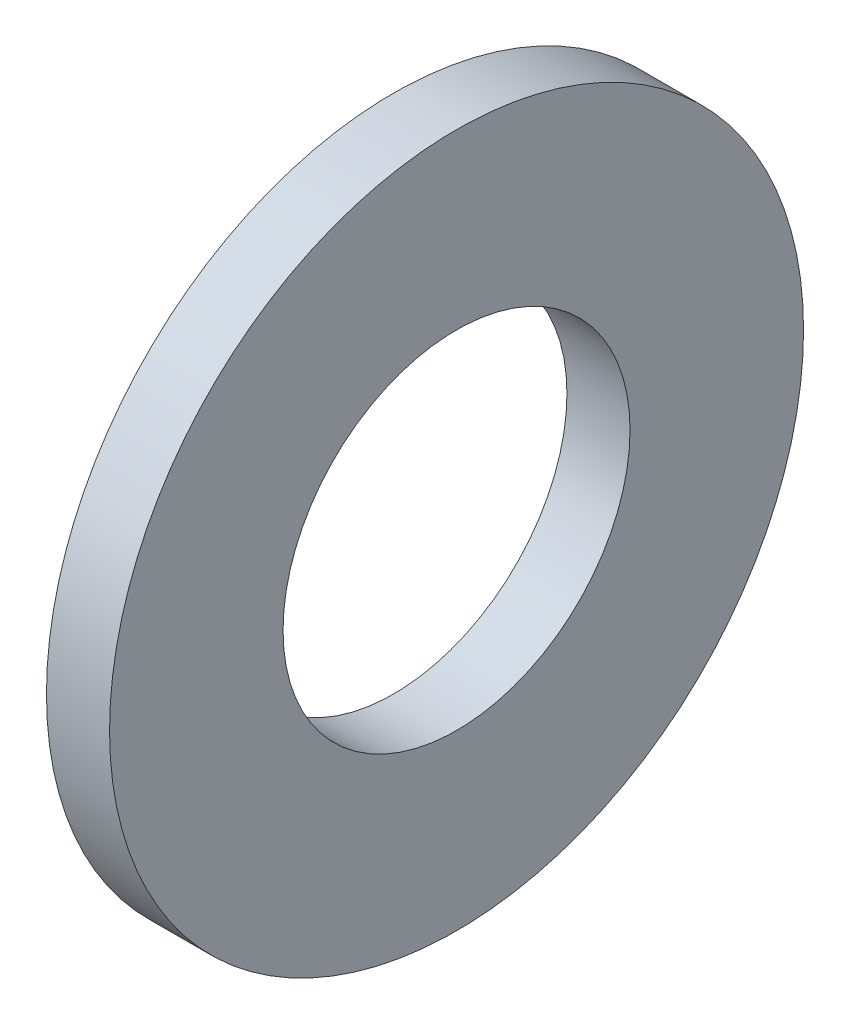
ISO-10303-21;
HEADER;
FILE_DESCRIPTION(('STEP AP214'),'2;1');
FILE_NAME('part.step','',(''),(''),'','','');
FILE_SCHEMA(('AUTOMOTIVE_DESIGN { 1 0 10303 214 1 1 1 1 }'));
ENDSEC;
DATA;
#1=APPLICATION_CONTEXT('core data for automotive mechanical design processes');
#2=APPLICATION_PROTOCOL_DEFINITION('international standard','automotive_design',2000,#1);
#3=PRODUCT_CONTEXT('',#1,'mechanical');
#4=PRODUCT('Part','Part','',(#3));
#5=PRODUCT_RELATED_PRODUCT_CATEGORY('part','',(#4));
#6=PRODUCT_DEFINITION_FORMATION('','',#4);
#7=PRODUCT_DEFINITION_CONTEXT('part definition',#1,'design');
#8=PRODUCT_DEFINITION('design','',#6,#7);
#9=PRODUCT_DEFINITION_SHAPE('','',#8);
#10=(LENGTH_UNIT() NAMED_UNIT(*) SI_UNIT(.MILLI.,.METRE.));
#11=(NAMED_UNIT(*) PLANE_ANGLE_UNIT() SI_UNIT($,.RADIAN.));
#12=(NAMED_UNIT(*) SI_UNIT($,.STERADIAN.) SOLID_ANGLE_UNIT());
#13=UNCERTAINTY_MEASURE_WITH_UNIT(LENGTH_MEASURE(1.E-05),#10,'distance_accuracy_value','');
#14=(GEOMETRIC_REPRESENTATION_CONTEXT(3) GLOBAL_UNCERTAINTY_ASSIGNED_CONTEXT((#13)) GLOBAL_UNIT_ASSIGNED_CONTEXT((#10,
#11,#12)) REPRESENTATION_CONTEXT('',''));
#15=CARTESIAN_POINT('',(0.,0.,0.));
#16=DIRECTION('',(0.,0.,1.));
#17=DIRECTION('',(1.,0.,0.));
#18=AXIS2_PLACEMENT_3D('',#15,#16,#17);
#19=CARTESIAN_POINT('',(1.,0.,0.));
#20=DIRECTION('',(1.,0.,0.));
#21=DIRECTION('',(0.,0.,-1.));
#22=AXIS2_PLACEMENT_3D('',#19,#20,#21);
#23=PLANE('',#22);
#24=CARTESIAN_POINT('',(1.,0.,0.));
#25=DIRECTION('',(1.,0.,0.));
#26=DIRECTION('',(0.,0.,-1.));
#27=AXIS2_PLACEMENT_3D('',#24,#25,#26);
#28=CIRCLE('',#27,5.5);
#29=CARTESIAN_POINT('',(1.,0.,-5.5));
#30=VERTEX_POINT('',#29);
#31=EDGE_CURVE('E12',#30,#30,#28,.T.);
#32=ORIENTED_EDGE('',*,*,#31,.T.);
#33=EDGE_LOOP('',(#32));
#34=FACE_BOUND('',#33,.T.);
#35=CARTESIAN_POINT('',(1.,0.,0.));
#36=DIRECTION('',(1.,0.,0.));
#37=DIRECTION('',(0.,0.,-1.));
#38=AXIS2_PLACEMENT_3D('',#35,#36,#37);
#39=CIRCLE('',#38,2.75);
#40=CARTESIAN_POINT('',(1.,0.,-2.75));
#41=VERTEX_POINT('',#40);
#42=EDGE_CURVE('E51',#41,#41,#39,.T.);
#43=ORIENTED_EDGE('',*,*,#42,.F.);
#44=EDGE_LOOP('',(#43));
#45=FACE_BOUND('',#44,.T.);
#46=ADVANCED_FACE('F40',(#34,#45),#23,.T.);
#47=CARTESIAN_POINT('',(0.,0.,0.));
#48=DIRECTION('',(1.,0.,0.));
#49=DIRECTION('',(0.,0.,-1.));
#50=AXIS2_PLACEMENT_3D('',#47,#48,#49);
#51=PLANE('',#50);
#52=CARTESIAN_POINT('',(0.,0.,0.));
#53=DIRECTION('',(1.,0.,0.));
#54=DIRECTION('',(0.,0.,-1.));
#55=AXIS2_PLACEMENT_3D('',#52,#53,#54);
#56=CIRCLE('',#55,5.5);
#57=CARTESIAN_POINT('',(0.,0.,-5.5));
#58=VERTEX_POINT('',#57);
#59=EDGE_CURVE('E44',#58,#58,#56,.T.);
#60=ORIENTED_EDGE('',*,*,#59,.F.);
#61=EDGE_LOOP('',(#60));
#62=FACE_BOUND('',#61,.T.);
#63=CARTESIAN_POINT('',(0.,0.,0.));
#64=DIRECTION('',(1.,0.,0.));
#65=DIRECTION('',(0.,0.,-1.));
#66=AXIS2_PLACEMENT_3D('',#63,#64,#65);
#67=CIRCLE('',#66,2.75);
#68=CARTESIAN_POINT('',(0.,0.,-2.75));
#69=VERTEX_POINT('',#68);
#70=EDGE_CURVE('E53',#69,#69,#67,.T.);
#71=ORIENTED_EDGE('',*,*,#70,.T.);
#72=EDGE_LOOP('',(#71));
#73=FACE_BOUND('',#72,.T.);
#74=ADVANCED_FACE('F63',(#62,#73),#51,.F.);
#75=CARTESIAN_POINT('',(1.,0.,0.));
#76=DIRECTION('',(-1.,0.,0.));
#77=DIRECTION('',(0.,0.,1.));
#78=AXIS2_PLACEMENT_3D('',#75,#76,#77);
#79=CYLINDRICAL_SURFACE('',#78,5.5);
#80=ORIENTED_EDGE('',*,*,#31,.F.);
#81=EDGE_LOOP('',(#80));
#82=FACE_BOUND('',#81,.T.);
#83=ORIENTED_EDGE('',*,*,#59,.T.);
#84=EDGE_LOOP('',(#83));
#85=FACE_BOUND('',#84,.T.);
#86=ADVANCED_FACE('F42',(#82,#85),#79,.T.);
#87=CARTESIAN_POINT('',(1.,0.,0.));
#88=DIRECTION('',(-1.,0.,0.));
#89=DIRECTION('',(0.,0.,1.));
#90=AXIS2_PLACEMENT_3D('',#87,#88,#89);
#91=CYLINDRICAL_SURFACE('',#90,2.75);
#92=ORIENTED_EDGE('',*,*,#42,.T.);
#93=EDGE_LOOP('',(#92));
#94=FACE_BOUND('',#93,.T.);
#95=ORIENTED_EDGE('',*,*,#70,.F.);
#96=EDGE_LOOP('',(#95));
#97=FACE_BOUND('',#96,.T.);
#98=ADVANCED_FACE('F59',(#94,#97),#91,.F.);
#99=CLOSED_SHELL('',(#46,#74,#86,#98));
#100=MANIFOLD_SOLID_BREP('B2',#99);
#101=ADVANCED_BREP_SHAPE_REPRESENTATION('',(#18,#100),#14);
#102=SHAPE_DEFINITION_REPRESENTATION(#9,#101);
ENDSEC;
END-ISO-10303-21;
